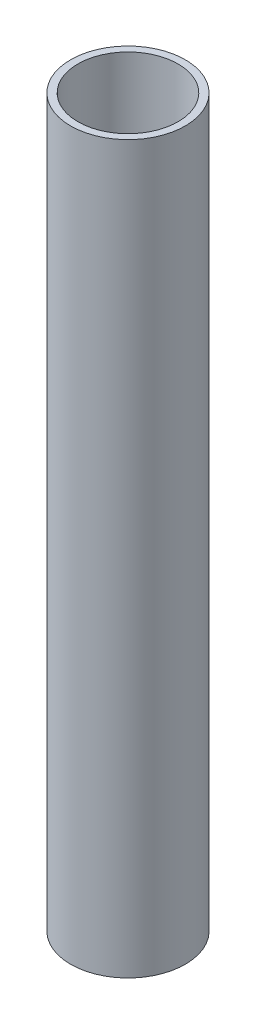
ISO-10303-21;
HEADER;
FILE_DESCRIPTION(('STEP AP214'),'2;1');
FILE_NAME('part.step','',(''),(''),'','','');
FILE_SCHEMA(('AUTOMOTIVE_DESIGN { 1 0 10303 214 1 1 1 1 }'));
ENDSEC;
DATA;
#1=APPLICATION_CONTEXT('core data for automotive mechanical design processes');
#2=APPLICATION_PROTOCOL_DEFINITION('international standard','automotive_design',2000,#1);
#3=PRODUCT_CONTEXT('',#1,'mechanical');
#4=PRODUCT('Part','Part','',(#3));
#5=PRODUCT_RELATED_PRODUCT_CATEGORY('part','',(#4));
#6=PRODUCT_DEFINITION_FORMATION('','',#4);
#7=PRODUCT_DEFINITION_CONTEXT('part definition',#1,'design');
#8=PRODUCT_DEFINITION('design','',#6,#7);
#9=PRODUCT_DEFINITION_SHAPE('','',#8);
#10=(LENGTH_UNIT() NAMED_UNIT(*) SI_UNIT(.MILLI.,.METRE.));
#11=(NAMED_UNIT(*) PLANE_ANGLE_UNIT() SI_UNIT($,.RADIAN.));
#12=(NAMED_UNIT(*) SI_UNIT($,.STERADIAN.) SOLID_ANGLE_UNIT());
#13=UNCERTAINTY_MEASURE_WITH_UNIT(LENGTH_MEASURE(1.E-05),#10,'distance_accuracy_value','');
#14=(GEOMETRIC_REPRESENTATION_CONTEXT(3) GLOBAL_UNCERTAINTY_ASSIGNED_CONTEXT((#13)) GLOBAL_UNIT_ASSIGNED_CONTEXT((#10,
#11,#12)) REPRESENTATION_CONTEXT('',''));
#15=CARTESIAN_POINT('',(0.,0.,0.));
#16=DIRECTION('',(0.,0.,1.));
#17=DIRECTION('',(1.,0.,0.));
#18=AXIS2_PLACEMENT_3D('',#15,#16,#17);
#19=CARTESIAN_POINT('',(0.,100.,0.));
#20=DIRECTION('',(0.,-1.,0.));
#21=DIRECTION('',(0.,0.,-1.));
#22=AXIS2_PLACEMENT_3D('',#19,#20,#21);
#23=CYLINDRICAL_SURFACE('',#22,7.9);
#24=CARTESIAN_POINT('',(0.,100.,0.));
#25=DIRECTION('',(0.,1.,0.));
#26=DIRECTION('',(0.,0.,1.));
#27=AXIS2_PLACEMENT_3D('',#24,#25,#26);
#28=CIRCLE('',#27,7.9);
#29=CARTESIAN_POINT('',(0.,100.,7.9));
#30=VERTEX_POINT('',#29);
#31=EDGE_CURVE('E10',#30,#30,#28,.T.);
#32=ORIENTED_EDGE('',*,*,#31,.F.);
#33=EDGE_LOOP('',(#32));
#34=FACE_BOUND('',#33,.T.);
#35=CARTESIAN_POINT('',(0.,0.,0.));
#36=DIRECTION('',(0.,1.,0.));
#37=DIRECTION('',(0.,0.,1.));
#38=AXIS2_PLACEMENT_3D('',#35,#36,#37);
#39=CIRCLE('',#38,7.9);
#40=CARTESIAN_POINT('',(0.,0.,7.9));
#41=VERTEX_POINT('',#40);
#42=EDGE_CURVE('E46',#41,#41,#39,.T.);
#43=ORIENTED_EDGE('',*,*,#42,.T.);
#44=EDGE_LOOP('',(#43));
#45=FACE_BOUND('',#44,.T.);
#46=ADVANCED_FACE('F43',(#34,#45),#23,.T.);
#47=CARTESIAN_POINT('',(0.,100.,0.));
#48=DIRECTION('',(0.,1.,0.));
#49=DIRECTION('',(0.,0.,1.));
#50=AXIS2_PLACEMENT_3D('',#47,#48,#49);
#51=PLANE('',#50);
#52=CARTESIAN_POINT('',(0.,100.,0.));
#53=DIRECTION('',(0.,1.,0.));
#54=DIRECTION('',(0.,0.,1.));
#55=AXIS2_PLACEMENT_3D('',#52,#53,#54);
#56=CIRCLE('',#55,6.9);
#57=CARTESIAN_POINT('',(0.,100.,6.9));
#58=VERTEX_POINT('',#57);
#59=EDGE_CURVE('E57',#58,#58,#56,.T.);
#60=ORIENTED_EDGE('',*,*,#59,.F.);
#61=EDGE_LOOP('',(#60));
#62=FACE_BOUND('',#61,.T.);
#63=ORIENTED_EDGE('',*,*,#31,.T.);
#64=EDGE_LOOP('',(#63));
#65=FACE_BOUND('',#64,.T.);
#66=ADVANCED_FACE('F74',(#62,#65),#51,.T.);
#67=CARTESIAN_POINT('',(0.,0.,0.));
#68=DIRECTION('',(0.,1.,0.));
#69=DIRECTION('',(0.,0.,1.));
#70=AXIS2_PLACEMENT_3D('',#67,#68,#69);
#71=PLANE('',#70);
#72=ORIENTED_EDGE('',*,*,#42,.F.);
#73=EDGE_LOOP('',(#72));
#74=FACE_BOUND('',#73,.T.);
#75=ADVANCED_FACE('F70',(#74),#71,.F.);
#76=CARTESIAN_POINT('',(0.,1.,0.));
#77=DIRECTION('',(0.,1.,0.));
#78=DIRECTION('',(0.,0.,1.));
#79=AXIS2_PLACEMENT_3D('',#76,#77,#78);
#80=CYLINDRICAL_SURFACE('',#79,6.9);
#81=CARTESIAN_POINT('',(0.,1.,0.));
#82=DIRECTION('',(0.,1.,0.));
#83=DIRECTION('',(0.,0.,1.));
#84=AXIS2_PLACEMENT_3D('',#81,#82,#83);
#85=CIRCLE('',#84,6.9);
#86=CARTESIAN_POINT('',(0.,1.,6.9));
#87=VERTEX_POINT('',#86);
#88=EDGE_CURVE('E55',#87,#87,#85,.T.);
#89=ORIENTED_EDGE('',*,*,#88,.F.);
#90=EDGE_LOOP('',(#89));
#91=FACE_BOUND('',#90,.T.);
#92=ORIENTED_EDGE('',*,*,#59,.T.);
#93=EDGE_LOOP('',(#92));
#94=FACE_BOUND('',#93,.T.);
#95=ADVANCED_FACE('F67',(#91,#94),#80,.F.);
#96=CARTESIAN_POINT('',(0.,1.,0.));
#97=DIRECTION('',(0.,1.,0.));
#98=DIRECTION('',(0.,0.,1.));
#99=AXIS2_PLACEMENT_3D('',#96,#97,#98);
#100=PLANE('',#99);
#101=ORIENTED_EDGE('',*,*,#88,.T.);
#102=EDGE_LOOP('',(#101));
#103=FACE_BOUND('',#102,.T.);
#104=ADVANCED_FACE('F65',(#103),#100,.T.);
#105=CLOSED_SHELL('',(#46,#66,#75,#95,#104));
#106=MANIFOLD_SOLID_BREP('B2',#105);
#107=ADVANCED_BREP_SHAPE_REPRESENTATION('',(#18,#106),#14);
#108=SHAPE_DEFINITION_REPRESENTATION(#9,#107);
ENDSEC;
END-ISO-10303-21;
